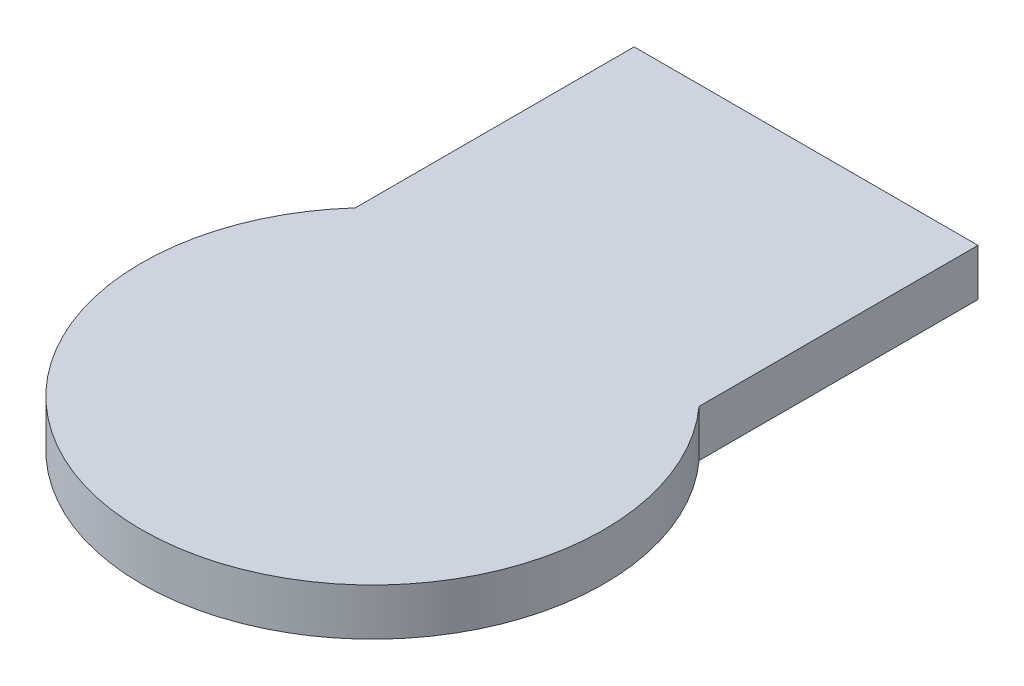
ISO-10303-21;
HEADER;
FILE_DESCRIPTION(('STEP AP214'),'2;1');
FILE_NAME('part.step','',(''),(''),'','','');
FILE_SCHEMA(('AUTOMOTIVE_DESIGN { 1 0 10303 214 1 1 1 1 }'));
ENDSEC;
DATA;
#1=APPLICATION_CONTEXT('core data for automotive mechanical design processes');
#2=APPLICATION_PROTOCOL_DEFINITION('international standard','automotive_design',2000,#1);
#3=PRODUCT_CONTEXT('',#1,'mechanical');
#4=PRODUCT('Part','Part','',(#3));
#5=PRODUCT_RELATED_PRODUCT_CATEGORY('part','',(#4));
#6=PRODUCT_DEFINITION_FORMATION('','',#4);
#7=PRODUCT_DEFINITION_CONTEXT('part definition',#1,'design');
#8=PRODUCT_DEFINITION('design','',#6,#7);
#9=PRODUCT_DEFINITION_SHAPE('','',#8);
#10=(LENGTH_UNIT() NAMED_UNIT(*) SI_UNIT(.MILLI.,.METRE.));
#11=(NAMED_UNIT(*) PLANE_ANGLE_UNIT() SI_UNIT($,.RADIAN.));
#12=(NAMED_UNIT(*) SI_UNIT($,.STERADIAN.) SOLID_ANGLE_UNIT());
#13=UNCERTAINTY_MEASURE_WITH_UNIT(LENGTH_MEASURE(1.E-05),#10,'distance_accuracy_value','');
#14=(GEOMETRIC_REPRESENTATION_CONTEXT(3) GLOBAL_UNCERTAINTY_ASSIGNED_CONTEXT((#13)) GLOBAL_UNIT_ASSIGNED_CONTEXT((#10,
#11,#12)) REPRESENTATION_CONTEXT('',''));
#15=CARTESIAN_POINT('',(0.,0.,0.));
#16=DIRECTION('',(0.,0.,1.));
#17=DIRECTION('',(1.,0.,0.));
#18=AXIS2_PLACEMENT_3D('',#15,#16,#17);
#19=CARTESIAN_POINT('',(2.53180000000001,1.3625,8.2762));
#20=DIRECTION('',(0.,1.,0.));
#21=DIRECTION('',(0.,0.,1.));
#22=AXIS2_PLACEMENT_3D('',#19,#20,#21);
#23=PLANE('',#22);
#24=DIRECTION('',(0.,0.,1.));
#25=VECTOR('',#24,1.);
#26=CARTESIAN_POINT('',(2.89800000000001,1.3625,8.2762));
#27=LINE('',#26,#25);
#28=CARTESIAN_POINT('',(2.89800000000001,1.3625,5.745));
#29=VERTEX_POINT('',#28);
#30=CARTESIAN_POINT('',(2.89800000000001,1.3625,6.71023369590071));
#31=VERTEX_POINT('',#30);
#32=EDGE_CURVE('E60',#29,#31,#27,.T.);
#33=ORIENTED_EDGE('',*,*,#32,.T.);
#34=CARTESIAN_POINT('',(3.49300000000001,1.3625,7.245));
#35=DIRECTION('',(0.,-1.,0.));
#36=DIRECTION('',(0.,0.,-1.));
#37=AXIS2_PLACEMENT_3D('',#34,#35,#36);
#38=CIRCLE('',#37,0.800000000000001);
#39=CARTESIAN_POINT('',(4.088,1.3625,6.71023369590072));
#40=VERTEX_POINT('',#39);
#41=EDGE_CURVE('E20',#40,#31,#38,.T.);
#42=ORIENTED_EDGE('',*,*,#41,.F.);
#43=DIRECTION('',(0.,0.,-1.));
#44=VECTOR('',#43,1.);
#45=CARTESIAN_POINT('',(4.08800000000001,1.3625,7.4079570654908));
#46=LINE('',#45,#44);
#47=CARTESIAN_POINT('',(4.08800000000001,1.3625,5.745));
#48=VERTEX_POINT('',#47);
#49=EDGE_CURVE('E55',#48,#40,#46,.F.);
#50=ORIENTED_EDGE('',*,*,#49,.F.);
#51=DIRECTION('',(1.,0.,0.));
#52=VECTOR('',#51,1.);
#53=CARTESIAN_POINT('',(2.53180000000001,1.3625,5.745));
#54=LINE('',#53,#52);
#55=EDGE_CURVE('E63',#48,#29,#54,.F.);
#56=ORIENTED_EDGE('',*,*,#55,.T.);
#57=EDGE_LOOP('',(#33,#42,#50,#56));
#58=FACE_BOUND('',#57,.T.);
#59=ADVANCED_FACE('F17',(#58),#23,.T.);
#60=CARTESIAN_POINT('',(4.08800000000001,0.695275,7.4079570654908));
#61=DIRECTION('',(1.,0.,0.));
#62=DIRECTION('',(0.,0.,-1.));
#63=AXIS2_PLACEMENT_3D('',#60,#61,#62);
#64=PLANE('',#63);
#65=DIRECTION('',(0.,-1.,0.));
#66=VECTOR('',#65,1.);
#67=CARTESIAN_POINT('',(4.088,1.182775,6.71023369590071));
#68=LINE('',#67,#66);
#69=CARTESIAN_POINT('',(4.088,1.2,6.71023369590072));
#70=VERTEX_POINT('',#69);
#71=EDGE_CURVE('E70',#70,#40,#68,.F.);
#72=ORIENTED_EDGE('',*,*,#71,.F.);
#73=DIRECTION('',(0.,0.,-1.));
#74=VECTOR('',#73,1.);
#75=CARTESIAN_POINT('',(4.08800000000001,1.2,8.2762));
#76=LINE('',#75,#74);
#77=CARTESIAN_POINT('',(4.08800000000001,1.2,5.745));
#78=VERTEX_POINT('',#77);
#79=EDGE_CURVE('E85',#78,#70,#76,.F.);
#80=ORIENTED_EDGE('',*,*,#79,.F.);
#81=DIRECTION('',(0.,1.,0.));
#82=VECTOR('',#81,1.);
#83=CARTESIAN_POINT('',(4.08800000000001,1.867225,5.745));
#84=LINE('',#83,#82);
#85=EDGE_CURVE('E74',#48,#78,#84,.F.);
#86=ORIENTED_EDGE('',*,*,#85,.F.);
#87=ORIENTED_EDGE('',*,*,#49,.T.);
#88=EDGE_LOOP('',(#72,#80,#86,#87));
#89=FACE_BOUND('',#88,.T.);
#90=ADVANCED_FACE('F105',(#89),#64,.T.);
#91=CARTESIAN_POINT('',(3.49300000000001,1.182775,7.245));
#92=DIRECTION('',(0.,-1.,0.));
#93=DIRECTION('',(0.,0.,-1.));
#94=AXIS2_PLACEMENT_3D('',#91,#92,#93);
#95=CYLINDRICAL_SURFACE('',#94,0.800000000000001);
#96=ORIENTED_EDGE('',*,*,#41,.T.);
#97=DIRECTION('',(0.,1.,0.));
#98=VECTOR('',#97,1.);
#99=CARTESIAN_POINT('',(2.89800000000001,0.695275,6.7102336959007));
#100=LINE('',#99,#98);
#101=CARTESIAN_POINT('',(2.89800000000001,1.2,6.71023369590071));
#102=VERTEX_POINT('',#101);
#103=EDGE_CURVE('E69',#102,#31,#100,.T.);
#104=ORIENTED_EDGE('',*,*,#103,.F.);
#105=CARTESIAN_POINT('',(3.49300000000001,1.2,7.245));
#106=DIRECTION('',(0.,-1.,0.));
#107=DIRECTION('',(0.,0.,-1.));
#108=AXIS2_PLACEMENT_3D('',#105,#106,#107);
#109=CIRCLE('',#108,0.800000000000001);
#110=EDGE_CURVE('E98',#70,#102,#109,.T.);
#111=ORIENTED_EDGE('',*,*,#110,.F.);
#112=ORIENTED_EDGE('',*,*,#71,.T.);
#113=EDGE_LOOP('',(#96,#104,#111,#112));
#114=FACE_BOUND('',#113,.T.);
#115=ADVANCED_FACE('F67',(#114),#95,.T.);
#116=CARTESIAN_POINT('',(2.89800000000001,0.695275,5.0472766304099));
#117=DIRECTION('',(-1.,0.,0.));
#118=DIRECTION('',(0.,0.,1.));
#119=AXIS2_PLACEMENT_3D('',#116,#117,#118);
#120=PLANE('',#119);
#121=ORIENTED_EDGE('',*,*,#103,.T.);
#122=ORIENTED_EDGE('',*,*,#32,.F.);
#123=DIRECTION('',(0.,1.,0.));
#124=VECTOR('',#123,1.);
#125=CARTESIAN_POINT('',(2.89800000000001,1.867225,5.745));
#126=LINE('',#125,#124);
#127=CARTESIAN_POINT('',(2.89800000000001,1.2,5.745));
#128=VERTEX_POINT('',#127);
#129=EDGE_CURVE('E35',#128,#29,#126,.T.);
#130=ORIENTED_EDGE('',*,*,#129,.F.);
#131=DIRECTION('',(0.,0.,-1.));
#132=VECTOR('',#131,1.);
#133=CARTESIAN_POINT('',(2.89800000000001,1.2,8.2762));
#134=LINE('',#133,#132);
#135=EDGE_CURVE('E26',#102,#128,#134,.T.);
#136=ORIENTED_EDGE('',*,*,#135,.F.);
#137=EDGE_LOOP('',(#121,#122,#130,#136));
#138=FACE_BOUND('',#137,.T.);
#139=ADVANCED_FACE('F71',(#138),#120,.T.);
#140=CARTESIAN_POINT('',(2.77780000000001,1.867225,5.745));
#141=DIRECTION('',(0.,0.,-1.));
#142=DIRECTION('',(-1.,0.,0.));
#143=AXIS2_PLACEMENT_3D('',#140,#141,#142);
#144=PLANE('',#143);
#145=ORIENTED_EDGE('',*,*,#129,.T.);
#146=ORIENTED_EDGE('',*,*,#55,.F.);
#147=ORIENTED_EDGE('',*,*,#85,.T.);
#148=DIRECTION('',(1.,0.,0.));
#149=VECTOR('',#148,1.);
#150=CARTESIAN_POINT('',(2.53180000000001,1.2,5.745));
#151=LINE('',#150,#149);
#152=EDGE_CURVE('E11',#128,#78,#151,.T.);
#153=ORIENTED_EDGE('',*,*,#152,.F.);
#154=EDGE_LOOP('',(#145,#146,#147,#153));
#155=FACE_BOUND('',#154,.T.);
#156=ADVANCED_FACE('F107',(#155),#144,.T.);
#157=CARTESIAN_POINT('',(2.53180000000001,1.2,8.2762));
#158=DIRECTION('',(0.,-1.,0.));
#159=DIRECTION('',(0.,0.,-1.));
#160=AXIS2_PLACEMENT_3D('',#157,#158,#159);
#161=PLANE('',#160);
#162=ORIENTED_EDGE('',*,*,#135,.T.);
#163=ORIENTED_EDGE('',*,*,#152,.T.);
#164=ORIENTED_EDGE('',*,*,#79,.T.);
#165=ORIENTED_EDGE('',*,*,#110,.T.);
#166=EDGE_LOOP('',(#162,#163,#164,#165));
#167=FACE_BOUND('',#166,.T.);
#168=ADVANCED_FACE('F104',(#167),#161,.T.);
#169=CLOSED_SHELL('',(#59,#90,#115,#139,#156,#168));
#170=MANIFOLD_SOLID_BREP('B1',#169);
#171=ADVANCED_BREP_SHAPE_REPRESENTATION('',(#18,#170),#14);
#172=SHAPE_DEFINITION_REPRESENTATION(#9,#171);
ENDSEC;
END-ISO-10303-21;
